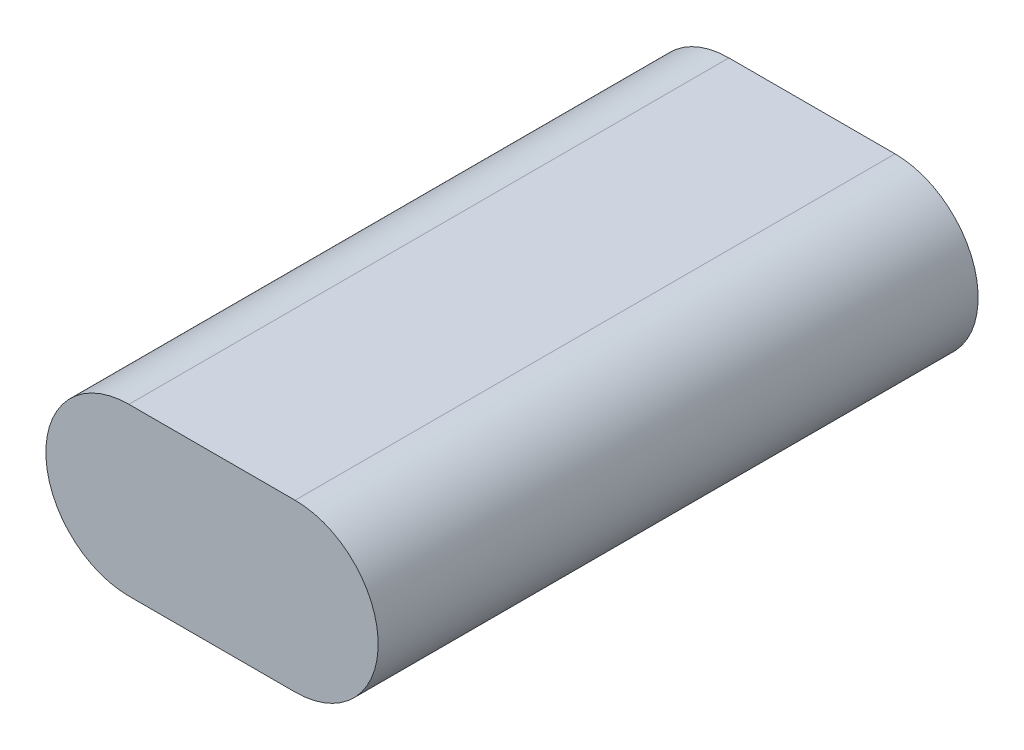
ISO-10303-21;
HEADER;
FILE_DESCRIPTION(('STEP AP214'),'2;1');
FILE_NAME('part.step','',(''),(''),'','','');
FILE_SCHEMA(('AUTOMOTIVE_DESIGN { 1 0 10303 214 1 1 1 1 }'));
ENDSEC;
DATA;
#1=APPLICATION_CONTEXT('core data for automotive mechanical design processes');
#2=APPLICATION_PROTOCOL_DEFINITION('international standard','automotive_design',2000,#1);
#3=PRODUCT_CONTEXT('',#1,'mechanical');
#4=PRODUCT('Part','Part','',(#3));
#5=PRODUCT_RELATED_PRODUCT_CATEGORY('part','',(#4));
#6=PRODUCT_DEFINITION_FORMATION('','',#4);
#7=PRODUCT_DEFINITION_CONTEXT('part definition',#1,'design');
#8=PRODUCT_DEFINITION('design','',#6,#7);
#9=PRODUCT_DEFINITION_SHAPE('','',#8);
#10=(LENGTH_UNIT() NAMED_UNIT(*) SI_UNIT(.MILLI.,.METRE.));
#11=(NAMED_UNIT(*) PLANE_ANGLE_UNIT() SI_UNIT($,.RADIAN.));
#12=(NAMED_UNIT(*) SI_UNIT($,.STERADIAN.) SOLID_ANGLE_UNIT());
#13=UNCERTAINTY_MEASURE_WITH_UNIT(LENGTH_MEASURE(1.E-05),#10,'distance_accuracy_value','');
#14=(GEOMETRIC_REPRESENTATION_CONTEXT(3) GLOBAL_UNCERTAINTY_ASSIGNED_CONTEXT((#13)) GLOBAL_UNIT_ASSIGNED_CONTEXT((#10,
#11,#12)) REPRESENTATION_CONTEXT('',''));
#15=CARTESIAN_POINT('',(0.,0.,0.));
#16=DIRECTION('',(0.,0.,1.));
#17=DIRECTION('',(1.,0.,0.));
#18=AXIS2_PLACEMENT_3D('',#15,#16,#17);
#19=CARTESIAN_POINT('',(18.,0.,65.));
#20=DIRECTION('',(0.,0.,-1.));
#21=DIRECTION('',(-1.,0.,0.));
#22=AXIS2_PLACEMENT_3D('',#19,#20,#21);
#23=CYLINDRICAL_SURFACE('',#22,9.00000000000001);
#24=CARTESIAN_POINT('',(18.,0.,0.));
#25=DIRECTION('',(0.,0.,1.));
#26=DIRECTION('',(1.,0.,0.));
#27=AXIS2_PLACEMENT_3D('',#24,#25,#26);
#28=CIRCLE('',#27,9.00000000000001);
#29=CARTESIAN_POINT('',(18.,-9.00000000000001,0.));
#30=VERTEX_POINT('',#29);
#31=CARTESIAN_POINT('',(18.,9.00000000000001,0.));
#32=VERTEX_POINT('',#31);
#33=EDGE_CURVE('E103',#30,#32,#28,.T.);
#34=ORIENTED_EDGE('',*,*,#33,.T.);
#35=DIRECTION('',(0.,0.,-1.));
#36=VECTOR('',#35,1.);
#37=CARTESIAN_POINT('',(18.,9.00000000000001,65.));
#38=LINE('',#37,#36);
#39=CARTESIAN_POINT('',(18.,9.00000000000001,65.));
#40=VERTEX_POINT('',#39);
#41=EDGE_CURVE('E11',#40,#32,#38,.T.);
#42=ORIENTED_EDGE('',*,*,#41,.F.);
#43=CARTESIAN_POINT('',(18.,0.,65.));
#44=DIRECTION('',(0.,0.,1.));
#45=DIRECTION('',(1.,0.,0.));
#46=AXIS2_PLACEMENT_3D('',#43,#44,#45);
#47=CIRCLE('',#46,9.00000000000001);
#48=CARTESIAN_POINT('',(18.,-9.00000000000001,65.));
#49=VERTEX_POINT('',#48);
#50=EDGE_CURVE('E82',#49,#40,#47,.T.);
#51=ORIENTED_EDGE('',*,*,#50,.F.);
#52=DIRECTION('',(0.,0.,-1.));
#53=VECTOR('',#52,1.);
#54=CARTESIAN_POINT('',(18.,-9.00000000000001,65.));
#55=LINE('',#54,#53);
#56=EDGE_CURVE('E102',#49,#30,#55,.T.);
#57=ORIENTED_EDGE('',*,*,#56,.T.);
#58=EDGE_LOOP('',(#34,#42,#51,#57));
#59=FACE_BOUND('',#58,.T.);
#60=ADVANCED_FACE('F40',(#59),#23,.T.);
#61=CARTESIAN_POINT('',(0.,9.,65.));
#62=DIRECTION('',(0.,1.,0.));
#63=DIRECTION('',(-1.,0.,0.));
#64=AXIS2_PLACEMENT_3D('',#61,#62,#63);
#65=PLANE('',#64);
#66=DIRECTION('',(1.,0.,0.));
#67=VECTOR('',#66,1.);
#68=CARTESIAN_POINT('',(0.,9.,0.));
#69=LINE('',#68,#67);
#70=CARTESIAN_POINT('',(0.,9.,0.));
#71=VERTEX_POINT('',#70);
#72=EDGE_CURVE('E92',#71,#32,#69,.T.);
#73=ORIENTED_EDGE('',*,*,#72,.F.);
#74=DIRECTION('',(0.,0.,-1.));
#75=VECTOR('',#74,1.);
#76=CARTESIAN_POINT('',(0.,9.,65.));
#77=LINE('',#76,#75);
#78=CARTESIAN_POINT('',(0.,9.,65.));
#79=VERTEX_POINT('',#78);
#80=EDGE_CURVE('E48',#79,#71,#77,.T.);
#81=ORIENTED_EDGE('',*,*,#80,.F.);
#82=DIRECTION('',(1.,0.,0.));
#83=VECTOR('',#82,1.);
#84=CARTESIAN_POINT('',(0.,9.,65.));
#85=LINE('',#84,#83);
#86=EDGE_CURVE('E90',#79,#40,#85,.T.);
#87=ORIENTED_EDGE('',*,*,#86,.T.);
#88=ORIENTED_EDGE('',*,*,#41,.T.);
#89=EDGE_LOOP('',(#73,#81,#87,#88));
#90=FACE_BOUND('',#89,.T.);
#91=ADVANCED_FACE('F89',(#90),#65,.T.);
#92=CARTESIAN_POINT('',(0.,0.,65.));
#93=DIRECTION('',(0.,0.,-1.));
#94=DIRECTION('',(-1.,0.,0.));
#95=AXIS2_PLACEMENT_3D('',#92,#93,#94);
#96=CYLINDRICAL_SURFACE('',#95,9.);
#97=CARTESIAN_POINT('',(0.,0.,0.));
#98=DIRECTION('',(0.,0.,1.));
#99=DIRECTION('',(1.,0.,0.));
#100=AXIS2_PLACEMENT_3D('',#97,#98,#99);
#101=CIRCLE('',#100,9.);
#102=CARTESIAN_POINT('',(0.,-9.,0.));
#103=VERTEX_POINT('',#102);
#104=EDGE_CURVE('E71',#71,#103,#101,.T.);
#105=ORIENTED_EDGE('',*,*,#104,.T.);
#106=DIRECTION('',(0.,0.,-1.));
#107=VECTOR('',#106,1.);
#108=CARTESIAN_POINT('',(0.,-9.,65.));
#109=LINE('',#108,#107);
#110=CARTESIAN_POINT('',(0.,-9.,65.));
#111=VERTEX_POINT('',#110);
#112=EDGE_CURVE('E93',#111,#103,#109,.T.);
#113=ORIENTED_EDGE('',*,*,#112,.F.);
#114=CARTESIAN_POINT('',(0.,0.,65.));
#115=DIRECTION('',(0.,0.,1.));
#116=DIRECTION('',(1.,0.,0.));
#117=AXIS2_PLACEMENT_3D('',#114,#115,#116);
#118=CIRCLE('',#117,9.);
#119=EDGE_CURVE('E94',#79,#111,#118,.T.);
#120=ORIENTED_EDGE('',*,*,#119,.F.);
#121=ORIENTED_EDGE('',*,*,#80,.T.);
#122=EDGE_LOOP('',(#105,#113,#120,#121));
#123=FACE_BOUND('',#122,.T.);
#124=ADVANCED_FACE('F95',(#123),#96,.T.);
#125=CARTESIAN_POINT('',(0.,-9.,65.));
#126=DIRECTION('',(0.,1.,0.));
#127=DIRECTION('',(-1.,0.,0.));
#128=AXIS2_PLACEMENT_3D('',#125,#126,#127);
#129=PLANE('',#128);
#130=DIRECTION('',(1.,0.,0.));
#131=VECTOR('',#130,1.);
#132=CARTESIAN_POINT('',(0.,-9.,0.));
#133=LINE('',#132,#131);
#134=EDGE_CURVE('E77',#103,#30,#133,.T.);
#135=ORIENTED_EDGE('',*,*,#134,.T.);
#136=ORIENTED_EDGE('',*,*,#56,.F.);
#137=DIRECTION('',(1.,0.,0.));
#138=VECTOR('',#137,1.);
#139=CARTESIAN_POINT('',(0.,-9.,65.));
#140=LINE('',#139,#138);
#141=EDGE_CURVE('E56',#111,#49,#140,.T.);
#142=ORIENTED_EDGE('',*,*,#141,.F.);
#143=ORIENTED_EDGE('',*,*,#112,.T.);
#144=EDGE_LOOP('',(#135,#136,#142,#143));
#145=FACE_BOUND('',#144,.T.);
#146=ADVANCED_FACE('F110',(#145),#129,.F.);
#147=CARTESIAN_POINT('',(0.,0.,65.));
#148=DIRECTION('',(0.,0.,1.));
#149=DIRECTION('',(1.,0.,0.));
#150=AXIS2_PLACEMENT_3D('',#147,#148,#149);
#151=PLANE('',#150);
#152=ORIENTED_EDGE('',*,*,#50,.T.);
#153=ORIENTED_EDGE('',*,*,#86,.F.);
#154=ORIENTED_EDGE('',*,*,#119,.T.);
#155=ORIENTED_EDGE('',*,*,#141,.T.);
#156=EDGE_LOOP('',(#152,#153,#154,#155));
#157=FACE_BOUND('',#156,.T.);
#158=ADVANCED_FACE('F97',(#157),#151,.T.);
#159=CARTESIAN_POINT('',(0.,0.,0.));
#160=DIRECTION('',(0.,0.,1.));
#161=DIRECTION('',(1.,0.,0.));
#162=AXIS2_PLACEMENT_3D('',#159,#160,#161);
#163=PLANE('',#162);
#164=ORIENTED_EDGE('',*,*,#33,.F.);
#165=ORIENTED_EDGE('',*,*,#134,.F.);
#166=ORIENTED_EDGE('',*,*,#104,.F.);
#167=ORIENTED_EDGE('',*,*,#72,.T.);
#168=EDGE_LOOP('',(#164,#165,#166,#167));
#169=FACE_BOUND('',#168,.T.);
#170=ADVANCED_FACE('F113',(#169),#163,.F.);
#171=CLOSED_SHELL('',(#60,#91,#124,#146,#158,#170));
#172=MANIFOLD_SOLID_BREP('B2',#171);
#173=ADVANCED_BREP_SHAPE_REPRESENTATION('',(#18,#172),#14);
#174=SHAPE_DEFINITION_REPRESENTATION(#9,#173);
ENDSEC;
END-ISO-10303-21;
